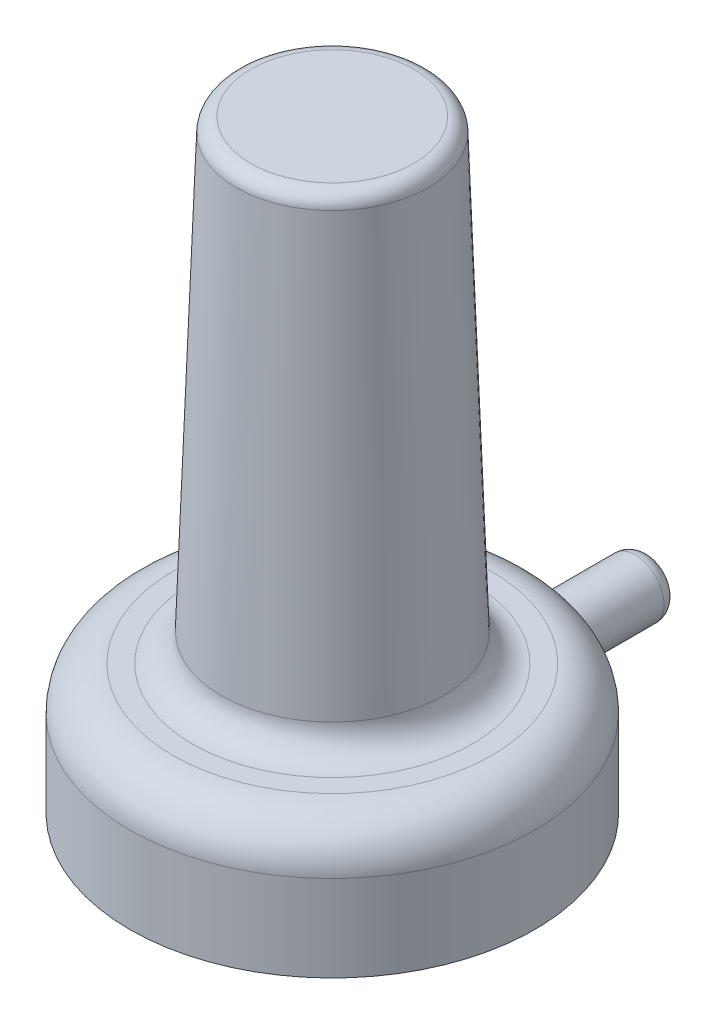
ISO-10303-21;
HEADER;
FILE_DESCRIPTION(('STEP AP214'),'2;1');
FILE_NAME('part.step','',(''),(''),'','','');
FILE_SCHEMA(('AUTOMOTIVE_DESIGN { 1 0 10303 214 1 1 1 1 }'));
ENDSEC;
DATA;
#1=APPLICATION_CONTEXT('core data for automotive mechanical design processes');
#2=APPLICATION_PROTOCOL_DEFINITION('international standard','automotive_design',2000,#1);
#3=PRODUCT_CONTEXT('',#1,'mechanical');
#4=PRODUCT('Part','Part','',(#3));
#5=PRODUCT_RELATED_PRODUCT_CATEGORY('part','',(#4));
#6=PRODUCT_DEFINITION_FORMATION('','',#4);
#7=PRODUCT_DEFINITION_CONTEXT('part definition',#1,'design');
#8=PRODUCT_DEFINITION('design','',#6,#7);
#9=PRODUCT_DEFINITION_SHAPE('','',#8);
#10=(LENGTH_UNIT() NAMED_UNIT(*) SI_UNIT(.MILLI.,.METRE.));
#11=(NAMED_UNIT(*) PLANE_ANGLE_UNIT() SI_UNIT($,.RADIAN.));
#12=(NAMED_UNIT(*) SI_UNIT($,.STERADIAN.) SOLID_ANGLE_UNIT());
#13=UNCERTAINTY_MEASURE_WITH_UNIT(LENGTH_MEASURE(1.E-05),#10,'distance_accuracy_value','');
#14=(GEOMETRIC_REPRESENTATION_CONTEXT(3) GLOBAL_UNCERTAINTY_ASSIGNED_CONTEXT((#13)) GLOBAL_UNIT_ASSIGNED_CONTEXT((#10,
#11,#12)) REPRESENTATION_CONTEXT('',''));
#15=CARTESIAN_POINT('',(0.,0.,0.));
#16=DIRECTION('',(0.,0.,1.));
#17=DIRECTION('',(1.,0.,0.));
#18=AXIS2_PLACEMENT_3D('',#15,#16,#17);
#19=CARTESIAN_POINT('',(0.,53.34,0.));
#20=DIRECTION('',(0.,-1.,0.));
#21=DIRECTION('',(0.,0.,-1.));
#22=AXIS2_PLACEMENT_3D('',#19,#20,#21);
#23=CYLINDRICAL_SURFACE('',#22,17.907);
#24=CARTESIAN_POINT('',(0.,6.35,-17.907));
#25=CARTESIAN_POINT('',(-0.141908894504003,6.34999408232061,-17.9069978147831));
#26=CARTESIAN_POINT('',(-0.283902328809885,6.33806726813499,-17.9052953801812));
#27=CARTESIAN_POINT('',(-0.563926400097885,6.29068372450717,-17.8986678439135));
#28=CARTESIAN_POINT('',(-0.701952938277808,6.25520351022497,-17.8937395258228));
#29=CARTESIAN_POINT('',(-0.969949684848666,6.1617894685795,-17.8812145289546));
#30=CARTESIAN_POINT('',(-1.09992567377179,6.10387197380852,-17.8736197914988));
#31=CARTESIAN_POINT('',(-1.34829226877817,5.96726595989189,-17.8566030583465));
#32=CARTESIAN_POINT('',(-1.46668461018489,5.88858055849613,-17.8471813369795));
#33=CARTESIAN_POINT('',(-1.68937542888251,5.71208343169165,-17.8274858902503));
#34=CARTESIAN_POINT('',(-1.79358086200928,5.61415485279318,-17.8172071922154));
#35=CARTESIAN_POINT('',(-1.98413755848586,5.40220253941335,-17.796995586389));
#36=CARTESIAN_POINT('',(-2.07048783706276,5.2881779177634,-17.7870626976952));
#37=CARTESIAN_POINT('',(-2.2232401242741,5.04665183140287,-17.7686189369167));
#38=CARTESIAN_POINT('',(-2.28955305304218,4.91909349556227,-17.7601144874557));
#39=CARTESIAN_POINT('',(-2.39977913475457,4.65450923599382,-17.7455577306314));
#40=CARTESIAN_POINT('',(-2.44369337875772,4.51748377378694,-17.7395053038309));
#41=CARTESIAN_POINT('',(-2.50758859927985,4.23882943199762,-17.7305863605023));
#42=CARTESIAN_POINT('',(-2.5277281807735,4.09723760802015,-17.727698740358));
#43=CARTESIAN_POINT('',(-2.54399353834387,3.81265686250015,-17.7253721400644));
#44=CARTESIAN_POINT('',(-2.54012054962969,3.66966801319852,-17.7259329825258));
#45=CARTESIAN_POINT('',(-2.50860051914633,3.38746730589211,-17.7304206329414));
#46=CARTESIAN_POINT('',(-2.48112944880971,3.2482353399808,-17.7343225259175));
#47=CARTESIAN_POINT('',(-2.40346820992278,2.97637736167279,-17.7450137382241));
#48=CARTESIAN_POINT('',(-2.35327746121206,2.84375151806334,-17.7518031312883));
#49=CARTESIAN_POINT('',(-2.23141646915132,2.58833124849776,-17.7675321310256));
#50=CARTESIAN_POINT('',(-2.15967102305212,2.46557318291479,-17.7764792439035));
#51=CARTESIAN_POINT('',(-1.99679086362963,2.23377199584149,-17.7955100257012));
#52=CARTESIAN_POINT('',(-1.90565501068137,2.12472968106137,-17.805593761407));
#53=CARTESIAN_POINT('',(-1.70561189442953,1.92243490244508,-17.8258719355661));
#54=CARTESIAN_POINT('',(-1.5965532013722,1.82933213609466,-17.836066558474));
#55=CARTESIAN_POINT('',(-1.36427810817226,1.66272915839818,-17.8553340019447));
#56=CARTESIAN_POINT('',(-1.24106165730728,1.5892290172847,-17.8644068184882));
#57=CARTESIAN_POINT('',(-0.983843907627091,1.46391262816609,-17.8804164600147));
#58=CARTESIAN_POINT('',(-0.849837278528037,1.41210717653738,-17.8873522210381));
#59=CARTESIAN_POINT('',(-0.574906204150894,1.33177695025879,-17.8982971654618));
#60=CARTESIAN_POINT('',(-0.43398217719914,1.30325076964045,-17.9023065256026));
#61=CARTESIAN_POINT('',(-0.150509426599685,1.27048615189546,-17.9069236685587));
#62=CARTESIAN_POINT('',(-0.00798495863371836,1.26604177066457,-17.9075602934744));
#63=CARTESIAN_POINT('',(0.275775043371797,1.28102136095559,-17.9054385263756));
#64=CARTESIAN_POINT('',(0.417010612871157,1.30044467382976,-17.9026802280467));
#65=CARTESIAN_POINT('',(0.693565423831515,1.3624370886937,-17.894096402077));
#66=CARTESIAN_POINT('',(0.828907435779864,1.40490659350492,-17.8882840762255));
#67=CARTESIAN_POINT('',(1.09054945904184,1.51168132279327,-17.8742421381552));
#68=CARTESIAN_POINT('',(1.21684908495791,1.57598747730504,-17.8660124229805));
#69=CARTESIAN_POINT('',(1.45773166358306,1.72509846041743,-17.8479794387503));
#70=CARTESIAN_POINT('',(1.57223243622935,1.81003482184576,-17.8381662140978));
#71=CARTESIAN_POINT('',(1.78542759523157,1.99781104783197,-17.8180915133269));
#72=CARTESIAN_POINT('',(1.88412116433267,2.10065183750086,-17.8078300140671));
#73=CARTESIAN_POINT('',(2.06364330836141,2.32223121985971,-17.7879246829111));
#74=CARTESIAN_POINT('',(2.14433434906607,2.44108177176917,-17.7782859808382));
#75=CARTESIAN_POINT('',(2.28460695979148,2.69077054716837,-17.7608062262454));
#76=CARTESIAN_POINT('',(2.34418905147153,2.82160847431702,-17.7529651293035));
#77=CARTESIAN_POINT('',(2.44033597583848,3.09113627621731,-17.7400048250494));
#78=CARTESIAN_POINT('',(2.47697496489696,3.22979925800234,-17.7348768568234));
#79=CARTESIAN_POINT('',(2.52643269172956,3.51138800770993,-17.7278995131466));
#80=CARTESIAN_POINT('',(2.53925288637339,3.65431351437304,-17.7260499371741));
#81=CARTESIAN_POINT('',(2.54067717849613,3.93900031238201,-17.7258457324975));
#82=CARTESIAN_POINT('',(2.52949744977541,4.08076054758693,-17.7274599048206));
#83=CARTESIAN_POINT('',(2.48370060273773,4.36036385607178,-17.7339337694687));
#84=CARTESIAN_POINT('',(2.44908350680232,4.49820693309228,-17.7387934586943));
#85=CARTESIAN_POINT('',(2.35746803028172,4.76601395428916,-17.7512003190137));
#86=CARTESIAN_POINT('',(2.30048315371773,4.89598259792047,-17.7587458683269));
#87=CARTESIAN_POINT('',(2.1657710384517,5.14454905670444,-17.775676450295));
#88=CARTESIAN_POINT('',(2.08804324840946,5.26314656950205,-17.7850615318422));
#89=CARTESIAN_POINT('',(1.91326033200451,5.48670504654045,-17.8047146103816));
#90=CARTESIAN_POINT('',(1.81604469098878,5.59153992289579,-17.8149895082633));
#91=CARTESIAN_POINT('',(1.60538428327628,5.78348654493718,-17.835205719298));
#92=CARTESIAN_POINT('',(1.49193573328131,5.87059414754717,-17.8451469540176));
#93=CARTESIAN_POINT('',(1.25138048919949,6.02498963134504,-17.8636308510812));
#94=CARTESIAN_POINT('',(1.12420960871696,6.09217832851896,-17.8721664234737));
#95=CARTESIAN_POINT('',(0.860331203821083,6.20414478174038,-17.8868071904127));
#96=CARTESIAN_POINT('',(0.723633899351228,6.24894614570216,-17.892914943749));
#97=CARTESIAN_POINT('',(0.488574611736386,6.30450721031167,-17.9005904700548));
#98=CARTESIAN_POINT('',(0.391675148484452,6.32154148014666,-17.9029819212559));
#99=CARTESIAN_POINT('',(0.196530631659635,6.34428986465777,-17.9061874346583));
#100=CARTESIAN_POINT('',(0.0982855922701754,6.35000409856356,-17.9070015134734));
#101=CARTESIAN_POINT('',(0.,6.35,-17.907));
#102=B_SPLINE_CURVE_WITH_KNOTS('',3,(#24,#25,#26,#27,#28,#29,#30,#31,#32,#33,#34,#35,#36,#37,
#38,#39,#40,#41,#42,#43,#44,#45,#46,#47,#48,#49,#50,#51,#52,#53,#54,#55,#56,#57,#58,#59,#60,#61,
#62,#63,#64,#65,#66,#67,#68,#69,#70,#71,#72,#73,#74,#75,#76,#77,#78,#79,#80,#81,#82,#83,#84,#85,
#86,#87,#88,#89,#90,#91,#92,#93,#94,#95,#96,#97,#98,#99,#100,#101),.UNSPECIFIED.,.T.,.F.,(4,2,2,
2,2,2,2,2,2,2,2,2,2,2,2,2,2,2,2,2,2,2,2,2,2,2,2,2,2,2,2,2,2,2,2,2,2,2,4),(0.,0.425367586994384,
0.851159941719458,1.27664293340321,1.70206208640546,2.130149198876,2.55825991552282,
2.98824678817101,3.41821271379483,3.84529375318133,4.27235282365733,4.69625467913797,
5.12016735981342,5.54557656372236,5.97101077695392,6.4002440828912,6.82947892667182,
7.2589271263369,7.68834938724645,8.1140934256417,8.53982571556031,8.96373263161482,
9.38765760435777,9.81435983363007,10.2410841168961,10.6709645878204,11.1008344344927,
11.5293075913748,11.957754539957,12.3823585528132,12.8069621601935,13.231309816442,
13.655668752843,14.083678315602,14.5117877947327,14.9419945117671,15.3717466043134,
15.6663577752068,15.9609658430548),.UNSPECIFIED.);
#103=CARTESIAN_POINT('',(0.,6.35,-17.907));
#104=VERTEX_POINT('',#103);
#105=EDGE_CURVE('E57',#104,#104,#102,.T.);
#106=ORIENTED_EDGE('',*,*,#105,.T.);
#107=EDGE_LOOP('',(#106));
#108=FACE_BOUND('',#107,.T.);
#109=CARTESIAN_POINT('',(0.,7.62,0.));
#110=DIRECTION('',(0.,1.,0.));
#111=DIRECTION('',(0.,0.,1.));
#112=AXIS2_PLACEMENT_3D('',#109,#110,#111);
#113=CIRCLE('',#112,17.907);
#114=CARTESIAN_POINT('',(0.,7.62,17.907));
#115=VERTEX_POINT('',#114);
#116=EDGE_CURVE('E112',#115,#115,#113,.F.);
#117=ORIENTED_EDGE('',*,*,#116,.T.);
#118=EDGE_LOOP('',(#117));
#119=FACE_BOUND('',#118,.T.);
#120=CARTESIAN_POINT('',(0.,0.,0.));
#121=DIRECTION('',(0.,1.,0.));
#122=DIRECTION('',(0.,0.,1.));
#123=AXIS2_PLACEMENT_3D('',#120,#121,#122);
#124=CIRCLE('',#123,17.907);
#125=CARTESIAN_POINT('',(0.,0.,17.907));
#126=VERTEX_POINT('',#125);
#127=EDGE_CURVE('E63',#126,#126,#124,.T.);
#128=ORIENTED_EDGE('',*,*,#127,.T.);
#129=EDGE_LOOP('',(#128));
#130=FACE_BOUND('',#129,.T.);
#131=ADVANCED_FACE('F35',(#108,#119,#130),#23,.T.);
#132=CARTESIAN_POINT('',(0.,0.,0.));
#133=DIRECTION('',(0.,1.,0.));
#134=DIRECTION('',(0.,0.,1.));
#135=AXIS2_PLACEMENT_3D('',#132,#133,#134);
#136=PLANE('',#135);
#137=ORIENTED_EDGE('',*,*,#127,.F.);
#138=EDGE_LOOP('',(#137));
#139=FACE_BOUND('',#138,.T.);
#140=ADVANCED_FACE('F79',(#139),#136,.F.);
#141=CARTESIAN_POINT('',(0.,11.43,0.));
#142=DIRECTION('',(0.,1.,0.));
#143=DIRECTION('',(0.,0.,1.));
#144=AXIS2_PLACEMENT_3D('',#141,#142,#143);
#145=PLANE('',#144);
#146=CARTESIAN_POINT('',(0.,11.43,0.));
#147=DIRECTION('',(0.,1.,0.));
#148=DIRECTION('',(0.,0.,1.));
#149=AXIS2_PLACEMENT_3D('',#146,#147,#148);
#150=CIRCLE('',#149,12.35884948801);
#151=CARTESIAN_POINT('',(0.,11.43,12.35884948801));
#152=VERTEX_POINT('',#151);
#153=EDGE_CURVE('E48',#152,#152,#150,.F.);
#154=ORIENTED_EDGE('',*,*,#153,.T.);
#155=EDGE_LOOP('',(#154));
#156=FACE_BOUND('',#155,.T.);
#157=CARTESIAN_POINT('',(0.,11.43,0.));
#158=DIRECTION('',(0.,1.,0.));
#159=DIRECTION('',(0.,0.,1.));
#160=AXIS2_PLACEMENT_3D('',#157,#158,#159);
#161=CIRCLE('',#160,14.097);
#162=CARTESIAN_POINT('',(0.,11.43,14.097));
#163=VERTEX_POINT('',#162);
#164=EDGE_CURVE('E109',#163,#163,#161,.T.);
#165=ORIENTED_EDGE('',*,*,#164,.T.);
#166=EDGE_LOOP('',(#165));
#167=FACE_BOUND('',#166,.T.);
#168=ADVANCED_FACE('F75',(#156,#167),#145,.T.);
#169=CARTESIAN_POINT('',(0.,11.43,0.));
#170=DIRECTION('',(0.,-1.,0.));
#171=DIRECTION('',(0.,0.,1.));
#172=AXIS2_PLACEMENT_3D('',#169,#170,#171);
#173=CONICAL_SURFACE('',#172,9.906,0.0349065850398867);
#174=CARTESIAN_POINT('',(0.,13.8813552783756,0.));
#175=DIRECTION('',(0.,1.,0.));
#176=DIRECTION('',(0.,0.,1.));
#177=AXIS2_PLACEMENT_3D('',#174,#175,#176);
#178=CIRCLE('',#177,9.82039678738147);
#179=CARTESIAN_POINT('',(0.,13.8813552783756,9.82039678738147));
#180=VERTEX_POINT('',#179);
#181=EDGE_CURVE('E54',#180,#180,#178,.T.);
#182=ORIENTED_EDGE('',*,*,#181,.T.);
#183=EDGE_LOOP('',(#182));
#184=FACE_BOUND('',#183,.T.);
#185=CARTESIAN_POINT('',(0.,52.1143223608122,0.));
#186=DIRECTION('',(0.,-1.,0.));
#187=DIRECTION('',(0.,0.,-1.));
#188=AXIS2_PLACEMENT_3D('',#185,#186,#187);
#189=CIRCLE('',#188,8.48527215691012);
#190=CARTESIAN_POINT('',(0.,52.1143223608122,-8.48527215691012));
#191=VERTEX_POINT('',#190);
#192=EDGE_CURVE('E103',#191,#191,#189,.T.);
#193=ORIENTED_EDGE('',*,*,#192,.T.);
#194=EDGE_LOOP('',(#193));
#195=FACE_BOUND('',#194,.T.);
#196=ADVANCED_FACE('F78',(#184,#195),#173,.T.);
#197=CARTESIAN_POINT('',(0.,53.34,0.));
#198=DIRECTION('',(0.,1.,0.));
#199=DIRECTION('',(0.,0.,1.));
#200=AXIS2_PLACEMENT_3D('',#197,#198,#199);
#201=PLANE('',#200);
#202=CARTESIAN_POINT('',(0.,53.34,0.));
#203=DIRECTION('',(0.,1.,0.));
#204=DIRECTION('',(0.,0.,1.));
#205=AXIS2_PLACEMENT_3D('',#202,#203,#204);
#206=CIRCLE('',#205,7.21604580659587);
#207=CARTESIAN_POINT('',(0.,53.34,7.21604580659587));
#208=VERTEX_POINT('',#207);
#209=EDGE_CURVE('E98',#208,#208,#206,.T.);
#210=ORIENTED_EDGE('',*,*,#209,.T.);
#211=EDGE_LOOP('',(#210));
#212=FACE_BOUND('',#211,.T.);
#213=ADVANCED_FACE('F83',(#212),#201,.T.);
#214=CARTESIAN_POINT('',(0.,52.07,0.));
#215=DIRECTION('',(0.,1.,0.));
#216=DIRECTION('',(0.,0.,1.));
#217=AXIS2_PLACEMENT_3D('',#214,#215,#216);
#218=TOROIDAL_SURFACE('',#217,7.21604580659587,1.27);
#219=ORIENTED_EDGE('',*,*,#192,.F.);
#220=EDGE_LOOP('',(#219));
#221=FACE_BOUND('',#220,.T.);
#222=ORIENTED_EDGE('',*,*,#209,.F.);
#223=EDGE_LOOP('',(#222));
#224=FACE_BOUND('',#223,.T.);
#225=ADVANCED_FACE('F86',(#221,#224),#218,.T.);
#226=CARTESIAN_POINT('',(0.,7.62,0.));
#227=DIRECTION('',(0.,1.,0.));
#228=DIRECTION('',(0.,0.,1.));
#229=AXIS2_PLACEMENT_3D('',#226,#227,#228);
#230=TOROIDAL_SURFACE('',#229,14.097,3.81);
#231=ORIENTED_EDGE('',*,*,#116,.F.);
#232=EDGE_LOOP('',(#231));
#233=FACE_BOUND('',#232,.T.);
#234=ORIENTED_EDGE('',*,*,#164,.F.);
#235=EDGE_LOOP('',(#234));
#236=FACE_BOUND('',#235,.T.);
#237=ADVANCED_FACE('F121',(#233,#236),#230,.T.);
#238=CARTESIAN_POINT('',(0.,13.97,0.));
#239=DIRECTION('',(0.,1.,0.));
#240=DIRECTION('',(0.,0.,1.));
#241=AXIS2_PLACEMENT_3D('',#238,#239,#240);
#242=TOROIDAL_SURFACE('',#241,12.35884948801,2.54);
#243=ORIENTED_EDGE('',*,*,#153,.F.);
#244=EDGE_LOOP('',(#243));
#245=FACE_BOUND('',#244,.T.);
#246=ORIENTED_EDGE('',*,*,#181,.F.);
#247=EDGE_LOOP('',(#246));
#248=FACE_BOUND('',#247,.T.);
#249=ADVANCED_FACE('F74',(#245,#248),#242,.F.);
#250=CARTESIAN_POINT('',(0.,3.81,-28.067));
#251=DIRECTION('',(0.,0.,1.));
#252=DIRECTION('',(1.,0.,0.));
#253=AXIS2_PLACEMENT_3D('',#250,#251,#252);
#254=CYLINDRICAL_SURFACE('',#253,2.54);
#255=CARTESIAN_POINT('',(0.,3.81,-26.797));
#256=DIRECTION('',(0.,0.,1.));
#257=DIRECTION('',(1.,0.,0.));
#258=AXIS2_PLACEMENT_3D('',#255,#256,#257);
#259=CIRCLE('',#258,2.54);
#260=CARTESIAN_POINT('',(2.54000000000001,3.81,-26.797));
#261=VERTEX_POINT('',#260);
#262=EDGE_CURVE('E43',#261,#261,#259,.T.);
#263=ORIENTED_EDGE('',*,*,#262,.T.);
#264=EDGE_LOOP('',(#263));
#265=FACE_BOUND('',#264,.T.);
#266=ORIENTED_EDGE('',*,*,#105,.F.);
#267=EDGE_LOOP('',(#266));
#268=FACE_BOUND('',#267,.T.);
#269=ADVANCED_FACE('F68',(#265,#268),#254,.T.);
#270=CARTESIAN_POINT('',(0.,3.81,-28.067));
#271=DIRECTION('',(0.,0.,1.));
#272=DIRECTION('',(1.,0.,0.));
#273=AXIS2_PLACEMENT_3D('',#270,#271,#272);
#274=PLANE('',#273);
#275=CARTESIAN_POINT('',(0.,3.81,-28.067));
#276=DIRECTION('',(0.,0.,1.));
#277=DIRECTION('',(1.,0.,0.));
#278=AXIS2_PLACEMENT_3D('',#275,#276,#277);
#279=CIRCLE('',#278,1.27);
#280=CARTESIAN_POINT('',(1.27000000000001,3.81,-28.067));
#281=VERTEX_POINT('',#280);
#282=EDGE_CURVE('E11',#281,#281,#279,.F.);
#283=ORIENTED_EDGE('',*,*,#282,.T.);
#284=EDGE_LOOP('',(#283));
#285=FACE_BOUND('',#284,.T.);
#286=ADVANCED_FACE('F73',(#285),#274,.F.);
#287=CARTESIAN_POINT('',(0.,3.81,-26.797));
#288=DIRECTION('',(0.,0.,1.));
#289=DIRECTION('',(1.,0.,0.));
#290=AXIS2_PLACEMENT_3D('',#287,#288,#289);
#291=DEGENERATE_TOROIDAL_SURFACE('',#290,1.27,1.27,.T.);
#292=ORIENTED_EDGE('',*,*,#282,.F.);
#293=EDGE_LOOP('',(#292));
#294=FACE_BOUND('',#293,.T.);
#295=ORIENTED_EDGE('',*,*,#262,.F.);
#296=EDGE_LOOP('',(#295));
#297=FACE_BOUND('',#296,.T.);
#298=ADVANCED_FACE('F37',(#294,#297),#291,.T.);
#299=CLOSED_SHELL('',(#131,#140,#168,#196,#213,#225,#237,#249,#269,#286,#298));
#300=MANIFOLD_SOLID_BREP('B2',#299);
#301=ADVANCED_BREP_SHAPE_REPRESENTATION('',(#18,#300),#14);
#302=SHAPE_DEFINITION_REPRESENTATION(#9,#301);
ENDSEC;
END-ISO-10303-21;
